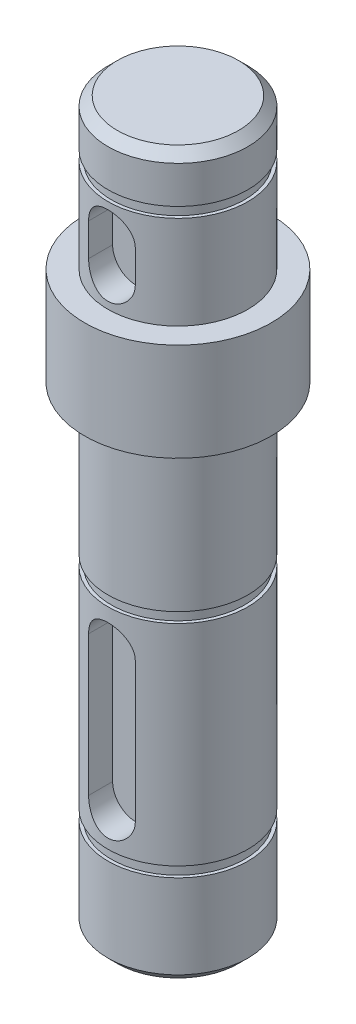
ISO-10303-21;
HEADER;
FILE_DESCRIPTION(('STEP AP214'),'2;1');
FILE_NAME('part.step','',(''),(''),'','','');
FILE_SCHEMA(('AUTOMOTIVE_DESIGN { 1 0 10303 214 1 1 1 1 }'));
ENDSEC;
DATA;
#1=APPLICATION_CONTEXT('core data for automotive mechanical design processes');
#2=APPLICATION_PROTOCOL_DEFINITION('international standard','automotive_design',2000,#1);
#3=PRODUCT_CONTEXT('',#1,'mechanical');
#4=PRODUCT('Part','Part','',(#3));
#5=PRODUCT_RELATED_PRODUCT_CATEGORY('part','',(#4));
#6=PRODUCT_DEFINITION_FORMATION('','',#4);
#7=PRODUCT_DEFINITION_CONTEXT('part definition',#1,'design');
#8=PRODUCT_DEFINITION('design','',#6,#7);
#9=PRODUCT_DEFINITION_SHAPE('','',#8);
#10=(LENGTH_UNIT() NAMED_UNIT(*) SI_UNIT(.MILLI.,.METRE.));
#11=(NAMED_UNIT(*) PLANE_ANGLE_UNIT() SI_UNIT($,.RADIAN.));
#12=(NAMED_UNIT(*) SI_UNIT($,.STERADIAN.) SOLID_ANGLE_UNIT());
#13=UNCERTAINTY_MEASURE_WITH_UNIT(LENGTH_MEASURE(1.E-05),#10,'distance_accuracy_value','');
#14=(GEOMETRIC_REPRESENTATION_CONTEXT(3) GLOBAL_UNCERTAINTY_ASSIGNED_CONTEXT((#13)) GLOBAL_UNIT_ASSIGNED_CONTEXT((#10,
#11,#12)) REPRESENTATION_CONTEXT('',''));
#15=CARTESIAN_POINT('',(0.,0.,0.));
#16=DIRECTION('',(0.,0.,1.));
#17=DIRECTION('',(1.,0.,0.));
#18=AXIS2_PLACEMENT_3D('',#15,#16,#17);
#19=CARTESIAN_POINT('',(0.,0.,0.));
#20=DIRECTION('',(0.,1.,0.));
#21=DIRECTION('',(0.,0.,1.00000000000001));
#22=AXIS2_PLACEMENT_3D('',#19,#20,#21);
#23=PLANE('',#22);
#24=CARTESIAN_POINT('',(0.,0.,0.));
#25=DIRECTION('',(0.,1.,0.));
#26=DIRECTION('',(0.,0.,1.00000000000001));
#27=AXIS2_PLACEMENT_3D('',#24,#25,#26);
#28=CIRCLE('',#27,6.50000000000001);
#29=CARTESIAN_POINT('',(0.,0.,6.50000000000009));
#30=VERTEX_POINT('',#29);
#31=EDGE_CURVE('E205',#30,#30,#28,.F.);
#32=ORIENTED_EDGE('',*,*,#31,.T.);
#33=EDGE_LOOP('',(#32));
#34=FACE_BOUND('',#33,.T.);
#35=ADVANCED_FACE('F32',(#34),#23,.F.);
#36=CARTESIAN_POINT('',(0.,0.,0.));
#37=DIRECTION('',(0.,-1.,0.));
#38=DIRECTION('',(0.,0.,-1.00000000000001));
#39=AXIS2_PLACEMENT_3D('',#36,#37,#38);
#40=CYLINDRICAL_SURFACE('',#39,7.5);
#41=CARTESIAN_POINT('',(0.,1.,0.));
#42=DIRECTION('',(0.,1.,0.));
#43=DIRECTION('',(0.,0.,1.00000000000001));
#44=AXIS2_PLACEMENT_3D('',#41,#42,#43);
#45=CIRCLE('',#44,7.5);
#46=CARTESIAN_POINT('',(0.,1.,7.5000000000001));
#47=VERTEX_POINT('',#46);
#48=EDGE_CURVE('E208',#47,#47,#45,.T.);
#49=ORIENTED_EDGE('',*,*,#48,.T.);
#50=EDGE_LOOP('',(#49));
#51=FACE_BOUND('',#50,.T.);
#52=CARTESIAN_POINT('',(0.,10.,0.));
#53=DIRECTION('',(0.,-1.,0.));
#54=DIRECTION('',(0.,0.,-1.00000000000001));
#55=AXIS2_PLACEMENT_3D('',#52,#53,#54);
#56=CIRCLE('',#55,7.5);
#57=CARTESIAN_POINT('',(0.,10.,-7.5000000000001));
#58=VERTEX_POINT('',#57);
#59=EDGE_CURVE('E196',#58,#58,#56,.T.);
#60=ORIENTED_EDGE('',*,*,#59,.T.);
#61=EDGE_LOOP('',(#60));
#62=FACE_BOUND('',#61,.T.);
#63=ADVANCED_FACE('F292',(#51,#62),#40,.T.);
#64=CARTESIAN_POINT('',(-7.49999999999997,10.,7.7715611723761E-13));
#65=DIRECTION('',(0.,-1.,0.));
#66=DIRECTION('',(0.,0.,-1.00000000000001));
#67=AXIS2_PLACEMENT_3D('',#64,#65,#66);
#68=PLANE('',#67);
#69=ORIENTED_EDGE('',*,*,#59,.F.);
#70=EDGE_LOOP('',(#69));
#71=FACE_BOUND('',#70,.T.);
#72=CARTESIAN_POINT('',(0.,10.,0.));
#73=DIRECTION('',(0.,-1.,0.));
#74=DIRECTION('',(0.,0.,-1.00000000000001));
#75=AXIS2_PLACEMENT_3D('',#72,#73,#74);
#76=CIRCLE('',#75,7.15);
#77=CARTESIAN_POINT('',(0.,10.,-7.1500000000001));
#78=VERTEX_POINT('',#77);
#79=EDGE_CURVE('E193',#78,#78,#76,.T.);
#80=ORIENTED_EDGE('',*,*,#79,.T.);
#81=EDGE_LOOP('',(#80));
#82=FACE_BOUND('',#81,.T.);
#83=ADVANCED_FACE('F298',(#71,#82),#68,.F.);
#84=CARTESIAN_POINT('',(0.,0.,0.));
#85=DIRECTION('',(0.,-1.,0.));
#86=DIRECTION('',(0.,0.,-1.00000000000001));
#87=AXIS2_PLACEMENT_3D('',#84,#85,#86);
#88=CYLINDRICAL_SURFACE('',#87,7.15);
#89=ORIENTED_EDGE('',*,*,#79,.F.);
#90=EDGE_LOOP('',(#89));
#91=FACE_BOUND('',#90,.T.);
#92=CARTESIAN_POINT('',(0.,11.1,0.));
#93=DIRECTION('',(0.,-1.,0.));
#94=DIRECTION('',(0.,0.,-1.00000000000001));
#95=AXIS2_PLACEMENT_3D('',#92,#93,#94);
#96=CIRCLE('',#95,7.15);
#97=CARTESIAN_POINT('',(0.,11.1,-7.1500000000001));
#98=VERTEX_POINT('',#97);
#99=EDGE_CURVE('E190',#98,#98,#96,.T.);
#100=ORIENTED_EDGE('',*,*,#99,.T.);
#101=EDGE_LOOP('',(#100));
#102=FACE_BOUND('',#101,.T.);
#103=ADVANCED_FACE('F324',(#91,#102),#88,.T.);
#104=CARTESIAN_POINT('',(-7.14999999999974,11.1,6.66133814775094E-13));
#105=DIRECTION('',(0.,1.,0.));
#106=DIRECTION('',(0.,0.,1.00000000000001));
#107=AXIS2_PLACEMENT_3D('',#104,#105,#106);
#108=PLANE('',#107);
#109=ORIENTED_EDGE('',*,*,#99,.F.);
#110=EDGE_LOOP('',(#109));
#111=FACE_BOUND('',#110,.T.);
#112=CARTESIAN_POINT('',(0.,11.1,0.));
#113=DIRECTION('',(0.,-1.,0.));
#114=DIRECTION('',(0.,0.,-1.00000000000001));
#115=AXIS2_PLACEMENT_3D('',#112,#113,#114);
#116=CIRCLE('',#115,7.5);
#117=CARTESIAN_POINT('',(0.,11.1,-7.5000000000001));
#118=VERTEX_POINT('',#117);
#119=EDGE_CURVE('E187',#118,#118,#116,.T.);
#120=ORIENTED_EDGE('',*,*,#119,.T.);
#121=EDGE_LOOP('',(#120));
#122=FACE_BOUND('',#121,.T.);
#123=ADVANCED_FACE('F329',(#111,#122),#108,.F.);
#124=CARTESIAN_POINT('',(0.,0.,0.));
#125=DIRECTION('',(0.,-1.,0.));
#126=DIRECTION('',(0.,0.,-1.00000000000001));
#127=AXIS2_PLACEMENT_3D('',#124,#125,#126);
#128=CYLINDRICAL_SURFACE('',#127,7.5);
#129=DIRECTION('',(0.,-1.,0.));
#130=VECTOR('',#129,1.);
#131=CARTESIAN_POINT('',(-2.4999999999996,0.,7.07106781186628));
#132=LINE('',#131,#130);
#133=CARTESIAN_POINT('',(-2.4999999999996,14.6377050832933,7.07106781186628));
#134=VERTEX_POINT('',#133);
#135=CARTESIAN_POINT('',(-2.4999999999996,29.6377050832933,7.07106781186628));
#136=VERTEX_POINT('',#135);
#137=EDGE_CURVE('E471',#134,#136,#132,.F.);
#138=ORIENTED_EDGE('',*,*,#137,.T.);
#139=CARTESIAN_POINT('',(2.50000000000049,29.6377050832933,7.071067811866));
#140=CARTESIAN_POINT('',(2.50000064486976,29.5015346462031,7.07106736326136));
#141=CARTESIAN_POINT('',(2.48883695921412,29.3653680837343,7.07504423227124));
#142=CARTESIAN_POINT('',(2.44462782922232,29.0970690308077,7.09043935203135));
#143=CARTESIAN_POINT('',(2.41157878042144,28.9649372086122,7.10185882855558));
#144=CARTESIAN_POINT('',(2.32488871421272,28.7086378508001,7.13070509222063));
#145=CARTESIAN_POINT('',(2.27128805350842,28.5844552596864,7.14812009928298));
#146=CARTESIAN_POINT('',(2.14515407110364,28.3468049619233,7.18697805025803));
#147=CARTESIAN_POINT('',(2.07261657215068,28.2333396269093,7.20842188259109));
#148=CARTESIAN_POINT('',(1.90762786610741,28.0159051774476,7.25386223518775));
#149=CARTESIAN_POINT('',(1.81456085344498,27.912416511614,7.27792237111622));
#150=CARTESIAN_POINT('',(1.61246916803629,27.7221880802316,7.32534662002484));
#151=CARTESIAN_POINT('',(1.50344193763139,27.6354510043373,7.34871062072425));
#152=CARTESIAN_POINT('',(1.26901126991302,27.4790078399693,7.39284667304532));
#153=CARTESIAN_POINT('',(1.14325477806167,27.4098051567484,7.41353519254015));
#154=CARTESIAN_POINT('',(0.881078057468857,27.2937261204746,7.44923966927449));
#155=CARTESIAN_POINT('',(0.744660714218143,27.2468437503511,7.4642571550752));
#156=CARTESIAN_POINT('',(0.470072043583812,27.1783654467124,7.48647688579775));
#157=CARTESIAN_POINT('',(0.332126887132525,27.1559464676508,7.49393286943879));
#158=CARTESIAN_POINT('',(0.0542446870603909,27.1344143498917,7.50109020545638));
#159=CARTESIAN_POINT('',(-0.0856918338595376,27.1352952041623,7.50079355657322));
#160=CARTESIAN_POINT('',(-0.357758787984247,27.1598157197084,7.49265099046906));
#161=CARTESIAN_POINT('',(-0.489980121478803,27.1825614044796,7.48510161887804));
#162=CARTESIAN_POINT('',(-0.748608597055104,27.2486875357445,7.46367418349324));
#163=CARTESIAN_POINT('',(-0.875015344447776,27.2920693807429,7.44979569078));
#164=CARTESIAN_POINT('',(-1.1203811871047,27.3987583765585,7.41689175733119));
#165=CARTESIAN_POINT('',(-1.23922055242185,27.4623199296597,7.39780106310056));
#166=CARTESIAN_POINT('',(-1.46481081381815,27.607354346915,7.35645982597288));
#167=CARTESIAN_POINT('',(-1.57155833596333,27.6888321916124,7.33420840503671));
#168=CARTESIAN_POINT('',(-1.7752521663782,27.8718910669425,7.28765479624743));
#169=CARTESIAN_POINT('',(-1.87150039266294,27.974237977897,7.26330537922178));
#170=CARTESIAN_POINT('',(-2.04569314899506,28.1938268976099,7.21618338122284));
#171=CARTESIAN_POINT('',(-2.12363485820353,28.3110711976135,7.19341104364138));
#172=CARTESIAN_POINT('',(-2.25996863758904,28.5593391473019,7.15176312802871));
#173=CARTESIAN_POINT('',(-2.31806615905298,28.6905354115877,7.13294773211882));
#174=CARTESIAN_POINT('',(-2.41110798317304,28.9616335688293,7.10204127060972));
#175=CARTESIAN_POINT('',(-2.44606198936855,29.1015317863089,7.08994738717817));
#176=CARTESIAN_POINT('',(-2.49040320524364,29.3793009718222,7.07449090789047));
#177=CARTESIAN_POINT('',(-2.50087273876883,29.5169786451649,7.07075900796904));
#178=CARTESIAN_POINT('',(-2.49901359727394,29.7921454560785,7.07141680147968));
#179=CARTESIAN_POINT('',(-2.48668906306654,29.9296346233532,7.07580501979606));
#180=CARTESIAN_POINT('',(-2.4405641288804,30.1955974975731,7.09184045225822));
#181=CARTESIAN_POINT('',(-2.40751598495134,30.3242186586704,7.10323313602119));
#182=CARTESIAN_POINT('',(-2.32178465640091,30.5740640988913,7.1317138417756));
#183=CARTESIAN_POINT('',(-2.2690979909084,30.6952870622703,7.1488028733714));
#184=CARTESIAN_POINT('',(-2.14368585184719,30.9311561354108,7.18742193989518));
#185=CARTESIAN_POINT('',(-2.07037779589599,31.0454716898977,7.20907564164091));
#186=CARTESIAN_POINT('',(-1.90646407639369,31.2605702142525,7.25414421827406));
#187=CARTESIAN_POINT('',(-1.81585331374691,31.3613491799464,7.27755961109483));
#188=CARTESIAN_POINT('',(-1.61472926475084,31.5515250435199,7.32487596594625));
#189=CARTESIAN_POINT('',(-1.50346817636656,31.6401410583403,7.34874608944744));
#190=CARTESIAN_POINT('',(-1.26706822850055,31.7974954391633,7.39317129032773));
#191=CARTESIAN_POINT('',(-1.14192986216136,31.8662345111993,7.41372648544236));
#192=CARTESIAN_POINT('',(-0.881949656080766,31.9812553454476,7.44911014526505));
#193=CARTESIAN_POINT('',(-0.747177808302993,32.0276832761634,7.46397575011325));
#194=CARTESIAN_POINT('',(-0.471146164615023,32.0970244384435,7.48646527094439));
#195=CARTESIAN_POINT('',(-0.329888729884711,32.1199461579946,7.49409180085055));
#196=CARTESIAN_POINT('',(-0.0520383396500712,32.1408602773075,7.50104658090635));
#197=CARTESIAN_POINT('',(0.0844618098001009,32.1399737181243,7.50074800223573));
#198=CARTESIAN_POINT('',(0.355277862500582,32.1160618129273,7.49280491298519));
#199=CARTESIAN_POINT('',(0.489593942047859,32.0930382629114,7.48516099834033));
#200=CARTESIAN_POINT('',(0.750105298580378,32.0262494968534,7.46352287386108));
#201=CARTESIAN_POINT('',(0.876395677282151,31.982819544911,7.44963145902865));
#202=CARTESIAN_POINT('',(1.11994587734974,31.8767612555505,7.41692901761238));
#203=CARTESIAN_POINT('',(1.23720406035646,31.8141294453008,7.39811710120132));
#204=CARTESIAN_POINT('',(1.46408504077233,31.6687813030383,7.35664672069797));
#205=CARTESIAN_POINT('',(1.57326562889425,31.5854083698394,7.33387181229817));
#206=CARTESIAN_POINT('',(1.77645256568119,31.402061605403,7.28732471979691));
#207=CARTESIAN_POINT('',(1.87045405406162,31.3020824776365,7.2635522193282));
#208=CARTESIAN_POINT('',(2.04435452208298,31.0836816943259,7.21658199564078));
#209=CARTESIAN_POINT('',(2.12355741499494,30.9646913058518,7.19344319971572));
#210=CARTESIAN_POINT('',(2.26078585825307,30.7143690160365,7.15150483307528));
#211=CARTESIAN_POINT('',(2.31881694204906,30.5830403507192,7.13270412903195));
#212=CARTESIAN_POINT('',(2.40960957051077,30.3178005232542,7.10253335516356));
#213=CARTESIAN_POINT('',(2.44339477287406,30.1842744244799,7.09086582142949));
#214=CARTESIAN_POINT('',(2.4885858003735,29.9130649571266,7.07513458848781));
#215=CARTESIAN_POINT('',(2.49999934799198,29.7753830397666,7.07106826543707));
#216=CARTESIAN_POINT('',(2.50000000000049,29.6377050832933,7.071067811866));
#217=B_SPLINE_CURVE_WITH_KNOTS('',3,(#139,#140,#141,#142,#143,#144,#145,#146,#147,#148,#149,
#150,#151,#152,#153,#154,#155,#156,#157,#158,#159,#160,#161,#162,#163,#164,#165,#166,#167,#168,
#169,#170,#171,#172,#173,#174,#175,#176,#177,#178,#179,#180,#181,#182,#183,#184,#185,#186,#187,
#188,#189,#190,#191,#192,#193,#194,#195,#196,#197,#198,#199,#200,#201,#202,#203,#204,#205,#206,
#207,#208,#209,#210,#211,#212,#213,#214,#215,#216),.UNSPECIFIED.,.T.,.F.,(4,2,2,2,2,2,2,2,2,2,2,
2,2,2,2,2,2,2,2,2,2,2,2,2,2,2,2,2,2,2,2,2,2,2,2,2,2,2,4),(0.,0.408001461998408,
0.816070137537933,1.22334156875217,1.63070291546379,2.05253343568925,2.47443162929956,
2.90733765359145,3.34012690966998,3.75785796912353,4.17548133255821,4.57672512063922,
4.97799610473093,5.38454137150855,5.79119979685083,6.217004359098,6.64287449030255,
7.07481599607636,7.50657628391537,7.91885728411096,8.33106339593086,8.72910989421941,
9.12722697867361,9.53797144339273,9.94883714155295,10.3794702042771,10.810087968938,
11.237844779771,11.6654470751036,12.0729521169407,12.4804241002444,12.8814239010107,
13.2824962690811,13.6983879880158,14.1144126108156,14.5467225684035,14.9789194566717,
15.3915803040673,15.8040986797616),.UNSPECIFIED.);
#218=CARTESIAN_POINT('',(2.50000000000049,29.6377050832933,7.071067811866));
#219=VERTEX_POINT('',#218);
#220=EDGE_CURVE('E211',#136,#219,#217,.T.);
#221=ORIENTED_EDGE('',*,*,#220,.T.);
#222=DIRECTION('',(0.,-1.,0.));
#223=VECTOR('',#222,1.);
#224=CARTESIAN_POINT('',(2.5000000000005,0.,7.07106781186603));
#225=LINE('',#224,#223);
#226=CARTESIAN_POINT('',(2.5000000000005,14.6377050832933,7.07106781186603));
#227=VERTEX_POINT('',#226);
#228=EDGE_CURVE('E473',#219,#227,#225,.T.);
#229=ORIENTED_EDGE('',*,*,#228,.T.);
#230=CARTESIAN_POINT('',(2.50000000000049,14.6377050832933,7.071067811866));
#231=CARTESIAN_POINT('',(2.50000899110442,14.569498005473,7.07105693273163));
#232=CARTESIAN_POINT('',(2.49720887221616,14.5012970086179,7.07205443904562));
#233=CARTESIAN_POINT('',(2.48606045780499,14.365424044944,7.07598524120994));
#234=CARTESIAN_POINT('',(2.47771365997232,14.2977519403052,7.07891801450636));
#235=CARTESIAN_POINT('',(2.45557459422824,14.1636145949387,7.08662705252492));
#236=CARTESIAN_POINT('',(2.44179847763162,14.0971463807424,7.09139784850088));
#237=CARTESIAN_POINT('',(2.40894181030153,13.9656968147105,7.10262619906012));
#238=CARTESIAN_POINT('',(2.38986106786074,13.9007155167034,7.10908381460397));
#239=CARTESIAN_POINT('',(2.32491551306247,13.7087435035787,7.13069940794033));
#240=CARTESIAN_POINT('',(2.27131416810282,13.5845259258232,7.14811243884055));
#241=CARTESIAN_POINT('',(2.14517784106272,13.3468282718298,7.18697034087501));
#242=CARTESIAN_POINT('',(2.07263123268553,13.2333548475131,7.20841768551152));
#243=CARTESIAN_POINT('',(1.90762995846841,13.0159121798226,7.25386182389573));
#244=CARTESIAN_POINT('',(1.81456284630853,12.9124199405251,7.27792189428079));
#245=CARTESIAN_POINT('',(1.61247071190543,12.7221879800596,7.32534626726013));
#246=CARTESIAN_POINT('',(1.50344285413703,12.6354512419743,7.34871044533539));
#247=CARTESIAN_POINT('',(1.2690092249402,12.4790068590309,7.39284706096379));
#248=CARTESIAN_POINT('',(1.14325025284497,12.4098027755511,7.41353593532889));
#249=CARTESIAN_POINT('',(0.88107309547547,12.2937243008586,7.4492402188327));
#250=CARTESIAN_POINT('',(0.744658181225998,12.2468430883676,7.46425736081219));
#251=CARTESIAN_POINT('',(0.470073371182981,12.1783658070351,7.48647677762791));
#252=CARTESIAN_POINT('',(0.332129588153846,12.1559469123361,7.49393272446123));
#253=CARTESIAN_POINT('',(0.0542474216363665,12.1344143265548,7.50109021034845));
#254=CARTESIAN_POINT('',(-0.0856904786400141,12.1352950823776,7.50079359709989));
#255=CARTESIAN_POINT('',(-0.357759612692117,12.1598157936938,7.49265096581853));
#256=CARTESIAN_POINT('',(-0.489981756427838,12.182561678898,7.48510152476457));
#257=CARTESIAN_POINT('',(-0.748610161076991,12.2486880792725,7.46367401253766));
#258=CARTESIAN_POINT('',(-0.875016099077476,12.2920697386186,7.44979559044836));
#259=CARTESIAN_POINT('',(-1.12038155754012,12.3987585074878,7.41689170677851));
#260=CARTESIAN_POINT('',(-1.23922126412477,12.462320196151,7.39780094595673));
#261=CARTESIAN_POINT('',(-1.46481147275351,12.6073549617183,7.35645969200226));
#262=CARTESIAN_POINT('',(-1.57155867428941,12.6888329108954,7.33420833994021));
#263=CARTESIAN_POINT('',(-1.77524334927512,12.8718827083002,7.28765679856814));
#264=CARTESIAN_POINT('',(-1.87148402903074,12.9742189423215,7.2633094669976));
#265=CARTESIAN_POINT('',(-2.04568006205137,13.1938088075798,7.21618726182169));
#266=CARTESIAN_POINT('',(-2.12362950795945,13.3110672393004,7.19341289789482));
#267=CARTESIAN_POINT('',(-2.26000831398147,13.5594055291776,7.15175078440873));
#268=CARTESIAN_POINT('',(-2.31813252376879,13.6906638706259,7.13292537370588));
#269=CARTESIAN_POINT('',(-2.41115057675256,13.9618225272679,7.10202742655118));
#270=CARTESIAN_POINT('',(-2.44608109013827,14.1017088167236,7.08994423522599));
#271=CARTESIAN_POINT('',(-2.47914539070187,14.3087516751633,7.0784135523687));
#272=CARTESIAN_POINT('',(-2.48696265313753,14.3743085579289,7.07566669236534));
#273=CARTESIAN_POINT('',(-2.49738654017764,14.5058002792928,7.0719925892849));
#274=CARTESIAN_POINT('',(-2.49999988848705,14.5717345196543,7.07106299823818));
#275=CARTESIAN_POINT('',(-2.49999999999961,14.6377050832933,7.07106781186626));
#276=B_SPLINE_CURVE_WITH_KNOTS('',3,(#230,#231,#232,#233,#234,#235,#236,#237,#238,#239,#240,
#241,#242,#243,#244,#245,#246,#247,#248,#249,#250,#251,#252,#253,#254,#255,#256,#257,#258,#259,
#260,#261,#262,#263,#264,#265,#266,#267,#268,#269,#270,#271,#272,#273,#274,#275),.UNSPECIFIED.,
.F.,.F.,(4,2,2,2,2,2,2,2,2,2,2,2,2,2,2,2,2,2,2,2,2,2,4),(0.,0.204546211838629,0.409037215423707,
0.612924429429108,0.816819012805421,1.22401016923265,1.63145179965543,2.05327864088394,
2.47518051341048,2.90809434014451,3.34087579484539,3.7586027850022,4.17623021758304,
4.57747647846033,4.97874498952317,5.38529148746632,5.79194868153645,6.2177173682683,
6.64362337304795,7.07581676501797,7.50732520398797,7.70536340013576,7.9031455550434),.UNSPECIFIED.);
#277=EDGE_CURVE('E55',#227,#134,#276,.T.);
#278=ORIENTED_EDGE('',*,*,#277,.T.);
#279=EDGE_LOOP('',(#138,#221,#229,#278));
#280=FACE_BOUND('',#279,.T.);
#281=ORIENTED_EDGE('',*,*,#119,.F.);
#282=EDGE_LOOP('',(#281));
#283=FACE_BOUND('',#282,.T.);
#284=CARTESIAN_POINT('',(0.,33.6,0.));
#285=DIRECTION('',(0.,-1.,0.));
#286=DIRECTION('',(0.,0.,-1.00000000000001));
#287=AXIS2_PLACEMENT_3D('',#284,#285,#286);
#288=CIRCLE('',#287,7.5);
#289=CARTESIAN_POINT('',(0.,33.6,-7.5000000000001));
#290=VERTEX_POINT('',#289);
#291=EDGE_CURVE('E184',#290,#290,#288,.T.);
#292=ORIENTED_EDGE('',*,*,#291,.T.);
#293=EDGE_LOOP('',(#292));
#294=FACE_BOUND('',#293,.T.);
#295=ADVANCED_FACE('F223',(#280,#283,#294),#128,.T.);
#296=CARTESIAN_POINT('',(-7.49999999999997,33.6,7.7715611723761E-13));
#297=DIRECTION('',(0.,-1.,0.));
#298=DIRECTION('',(0.,0.,-1.00000000000001));
#299=AXIS2_PLACEMENT_3D('',#296,#297,#298);
#300=PLANE('',#299);
#301=ORIENTED_EDGE('',*,*,#291,.F.);
#302=EDGE_LOOP('',(#301));
#303=FACE_BOUND('',#302,.T.);
#304=CARTESIAN_POINT('',(0.,33.6,0.));
#305=DIRECTION('',(0.,-1.,0.));
#306=DIRECTION('',(0.,0.,-1.00000000000001));
#307=AXIS2_PLACEMENT_3D('',#304,#305,#306);
#308=CIRCLE('',#307,7.15);
#309=CARTESIAN_POINT('',(0.,33.6,-7.1500000000001));
#310=VERTEX_POINT('',#309);
#311=EDGE_CURVE('E181',#310,#310,#308,.T.);
#312=ORIENTED_EDGE('',*,*,#311,.T.);
#313=EDGE_LOOP('',(#312));
#314=FACE_BOUND('',#313,.T.);
#315=ADVANCED_FACE('F339',(#303,#314),#300,.F.);
#316=CARTESIAN_POINT('',(0.,0.,0.));
#317=DIRECTION('',(0.,-1.,0.));
#318=DIRECTION('',(0.,0.,-1.00000000000001));
#319=AXIS2_PLACEMENT_3D('',#316,#317,#318);
#320=CYLINDRICAL_SURFACE('',#319,7.15);
#321=ORIENTED_EDGE('',*,*,#311,.F.);
#322=EDGE_LOOP('',(#321));
#323=FACE_BOUND('',#322,.T.);
#324=CARTESIAN_POINT('',(0.,34.7,0.));
#325=DIRECTION('',(0.,-1.,0.));
#326=DIRECTION('',(0.,0.,-1.00000000000001));
#327=AXIS2_PLACEMENT_3D('',#324,#325,#326);
#328=CIRCLE('',#327,7.15);
#329=CARTESIAN_POINT('',(0.,34.7,-7.1500000000001));
#330=VERTEX_POINT('',#329);
#331=EDGE_CURVE('E178',#330,#330,#328,.T.);
#332=ORIENTED_EDGE('',*,*,#331,.T.);
#333=EDGE_LOOP('',(#332));
#334=FACE_BOUND('',#333,.T.);
#335=ADVANCED_FACE('F345',(#323,#334),#320,.T.);
#336=CARTESIAN_POINT('',(-7.14999999999974,34.7,6.66133814775094E-13));
#337=DIRECTION('',(0.,1.,0.));
#338=DIRECTION('',(0.,0.,1.00000000000001));
#339=AXIS2_PLACEMENT_3D('',#336,#337,#338);
#340=PLANE('',#339);
#341=ORIENTED_EDGE('',*,*,#331,.F.);
#342=EDGE_LOOP('',(#341));
#343=FACE_BOUND('',#342,.T.);
#344=CARTESIAN_POINT('',(0.,34.7,0.));
#345=DIRECTION('',(0.,-1.,0.));
#346=DIRECTION('',(0.,0.,-1.00000000000001));
#347=AXIS2_PLACEMENT_3D('',#344,#345,#346);
#348=CIRCLE('',#347,7.5);
#349=CARTESIAN_POINT('',(0.,34.7,-7.5000000000001));
#350=VERTEX_POINT('',#349);
#351=EDGE_CURVE('E175',#350,#350,#348,.T.);
#352=ORIENTED_EDGE('',*,*,#351,.T.);
#353=EDGE_LOOP('',(#352));
#354=FACE_BOUND('',#353,.T.);
#355=ADVANCED_FACE('F350',(#343,#354),#340,.F.);
#356=CARTESIAN_POINT('',(0.,0.,0.));
#357=DIRECTION('',(0.,-1.,0.));
#358=DIRECTION('',(0.,0.,-1.00000000000001));
#359=AXIS2_PLACEMENT_3D('',#356,#357,#358);
#360=CYLINDRICAL_SURFACE('',#359,7.5);
#361=ORIENTED_EDGE('',*,*,#351,.F.);
#362=EDGE_LOOP('',(#361));
#363=FACE_BOUND('',#362,.T.);
#364=CARTESIAN_POINT('',(0.,50.7,0.));
#365=DIRECTION('',(0.,-1.,0.));
#366=DIRECTION('',(0.,0.,-1.00000000000001));
#367=AXIS2_PLACEMENT_3D('',#364,#365,#366);
#368=CIRCLE('',#367,7.5);
#369=CARTESIAN_POINT('',(0.,50.7,-7.5000000000001));
#370=VERTEX_POINT('',#369);
#371=EDGE_CURVE('E172',#370,#370,#368,.T.);
#372=ORIENTED_EDGE('',*,*,#371,.T.);
#373=EDGE_LOOP('',(#372));
#374=FACE_BOUND('',#373,.T.);
#375=ADVANCED_FACE('F356',(#363,#374),#360,.T.);
#376=CARTESIAN_POINT('',(-7.49999999999997,50.7,7.7715611723761E-13));
#377=DIRECTION('',(0.,1.,0.));
#378=DIRECTION('',(0.,0.,1.00000000000001));
#379=AXIS2_PLACEMENT_3D('',#376,#377,#378);
#380=PLANE('',#379);
#381=ORIENTED_EDGE('',*,*,#371,.F.);
#382=EDGE_LOOP('',(#381));
#383=FACE_BOUND('',#382,.T.);
#384=CARTESIAN_POINT('',(0.,50.7,0.));
#385=DIRECTION('',(0.,-1.,0.));
#386=DIRECTION('',(0.,0.,-1.00000000000001));
#387=AXIS2_PLACEMENT_3D('',#384,#385,#386);
#388=CIRCLE('',#387,10.);
#389=CARTESIAN_POINT('',(0.,50.7,-10.0000000000001));
#390=VERTEX_POINT('',#389);
#391=EDGE_CURVE('E169',#390,#390,#388,.T.);
#392=ORIENTED_EDGE('',*,*,#391,.T.);
#393=EDGE_LOOP('',(#392));
#394=FACE_BOUND('',#393,.T.);
#395=ADVANCED_FACE('F362',(#383,#394),#380,.F.);
#396=CARTESIAN_POINT('',(0.,0.,0.));
#397=DIRECTION('',(0.,-1.,0.));
#398=DIRECTION('',(0.,0.,-1.00000000000001));
#399=AXIS2_PLACEMENT_3D('',#396,#397,#398);
#400=CYLINDRICAL_SURFACE('',#399,10.);
#401=ORIENTED_EDGE('',*,*,#391,.F.);
#402=EDGE_LOOP('',(#401));
#403=FACE_BOUND('',#402,.T.);
#404=CARTESIAN_POINT('',(0.,61.2,0.));
#405=DIRECTION('',(0.,-1.,0.));
#406=DIRECTION('',(0.,0.,-1.00000000000001));
#407=AXIS2_PLACEMENT_3D('',#404,#405,#406);
#408=CIRCLE('',#407,10.);
#409=CARTESIAN_POINT('',(0.,61.2,-10.0000000000001));
#410=VERTEX_POINT('',#409);
#411=EDGE_CURVE('E166',#410,#410,#408,.T.);
#412=ORIENTED_EDGE('',*,*,#411,.T.);
#413=EDGE_LOOP('',(#412));
#414=FACE_BOUND('',#413,.T.);
#415=ADVANCED_FACE('F368',(#403,#414),#400,.T.);
#416=CARTESIAN_POINT('',(-9.99999999999994,61.2,8.60422844084496E-13));
#417=DIRECTION('',(0.,-1.,0.));
#418=DIRECTION('',(0.,0.,-1.00000000000001));
#419=AXIS2_PLACEMENT_3D('',#416,#417,#418);
#420=PLANE('',#419);
#421=ORIENTED_EDGE('',*,*,#411,.F.);
#422=EDGE_LOOP('',(#421));
#423=FACE_BOUND('',#422,.T.);
#424=CARTESIAN_POINT('',(0.,61.2,0.));
#425=DIRECTION('',(0.,-1.,0.));
#426=DIRECTION('',(0.,0.,-1.00000000000001));
#427=AXIS2_PLACEMENT_3D('',#424,#425,#426);
#428=CIRCLE('',#427,7.5);
#429=CARTESIAN_POINT('',(0.,61.2,-7.5000000000001));
#430=VERTEX_POINT('',#429);
#431=EDGE_CURVE('E163',#430,#430,#428,.T.);
#432=ORIENTED_EDGE('',*,*,#431,.T.);
#433=EDGE_LOOP('',(#432));
#434=FACE_BOUND('',#433,.T.);
#435=ADVANCED_FACE('F268',(#423,#434),#420,.F.);
#436=CARTESIAN_POINT('',(0.,0.,0.));
#437=DIRECTION('',(0.,-1.,0.));
#438=DIRECTION('',(0.,0.,-1.00000000000001));
#439=AXIS2_PLACEMENT_3D('',#436,#437,#438);
#440=CYLINDRICAL_SURFACE('',#439,7.5);
#441=DIRECTION('',(0.,-1.,0.));
#442=VECTOR('',#441,1.);
#443=CARTESIAN_POINT('',(-2.4999999999996,0.,7.07106781186628));
#444=LINE('',#443,#442);
#445=CARTESIAN_POINT('',(-2.4999999999996,64.45,7.07106781186628));
#446=VERTEX_POINT('',#445);
#447=CARTESIAN_POINT('',(-2.49999999999961,67.95,7.07106781186626));
#448=VERTEX_POINT('',#447);
#449=EDGE_CURVE('E11',#446,#448,#444,.F.);
#450=ORIENTED_EDGE('',*,*,#449,.T.);
#451=CARTESIAN_POINT('',(2.50000000000049,67.95,7.071067811866));
#452=CARTESIAN_POINT('',(2.50000064486976,67.8138295629098,7.07106736326136));
#453=CARTESIAN_POINT('',(2.48883695921411,67.677663000441,7.07504423227124));
#454=CARTESIAN_POINT('',(2.44462782922231,67.4093639475144,7.09043935203135));
#455=CARTESIAN_POINT('',(2.41157878042145,67.2772321253188,7.10185882855558));
#456=CARTESIAN_POINT('',(2.32488871421272,67.0209327675067,7.13070509222063));
#457=CARTESIAN_POINT('',(2.27128805350841,66.8967501763931,7.14812009928298));
#458=CARTESIAN_POINT('',(2.14515407110363,66.65909987863,7.18697805025803));
#459=CARTESIAN_POINT('',(2.07261657215068,66.5456345436159,7.20842188259109));
#460=CARTESIAN_POINT('',(1.90762786610741,66.3282000941543,7.25386223518775));
#461=CARTESIAN_POINT('',(1.81456085344498,66.2247114283207,7.27792237111622));
#462=CARTESIAN_POINT('',(1.61246916803629,66.0344829969383,7.32534662002484));
#463=CARTESIAN_POINT('',(1.50344193763139,65.947745921044,7.34871062072425));
#464=CARTESIAN_POINT('',(1.26901126991301,65.791302756676,7.39284667304532));
#465=CARTESIAN_POINT('',(1.14325477806166,65.7221000734551,7.41353519254015));
#466=CARTESIAN_POINT('',(0.881078057468845,65.6060210371812,7.44923966927449));
#467=CARTESIAN_POINT('',(0.744660714218142,65.5591386670577,7.4642571550752));
#468=CARTESIAN_POINT('',(0.470072043583816,65.490660363419,7.48647688579775));
#469=CARTESIAN_POINT('',(0.332126887132524,65.4682413843575,7.49393286943879));
#470=CARTESIAN_POINT('',(0.0542446870603876,65.4467092665984,7.50109020545638));
#471=CARTESIAN_POINT('',(-0.0856918338595384,65.447590120869,7.50079355657322));
#472=CARTESIAN_POINT('',(-0.357758787984247,65.4721106364151,7.49265099046906));
#473=CARTESIAN_POINT('',(-0.489980121478804,65.4948563211862,7.48510161887804));
#474=CARTESIAN_POINT('',(-0.748608597055105,65.5609824524512,7.46367418349324));
#475=CARTESIAN_POINT('',(-0.875015344447777,65.6043642974495,7.44979569078));
#476=CARTESIAN_POINT('',(-1.1203811871047,65.7110532932652,7.41689175733119));
#477=CARTESIAN_POINT('',(-1.23922055242185,65.7746148463664,7.39780106310056));
#478=CARTESIAN_POINT('',(-1.46481081381815,65.9196492636217,7.35645982597288));
#479=CARTESIAN_POINT('',(-1.57155833596333,66.0011271083191,7.33420840503671));
#480=CARTESIAN_POINT('',(-1.77525216637821,66.1841859836492,7.28765479624743));
#481=CARTESIAN_POINT('',(-1.87150039266294,66.2865328946037,7.26330537922179));
#482=CARTESIAN_POINT('',(-2.04569314899508,66.5061218143166,7.21618338122283));
#483=CARTESIAN_POINT('',(-2.12363485820357,66.6233661143201,7.19341104364132));
#484=CARTESIAN_POINT('',(-2.25996863758907,66.8716340640086,7.15176312802865));
#485=CARTESIAN_POINT('',(-2.31806615905299,67.0028303282944,7.1329477321188));
#486=CARTESIAN_POINT('',(-2.41110798317303,67.273928485536,7.10204127060973));
#487=CARTESIAN_POINT('',(-2.44606198936855,67.4138267030156,7.08994738717818));
#488=CARTESIAN_POINT('',(-2.49040320524364,67.6915958885289,7.07449090789047));
#489=CARTESIAN_POINT('',(-2.50087273876882,67.8292735618716,7.07075900796905));
#490=CARTESIAN_POINT('',(-2.49901359727395,68.1044403727852,7.07141680147967));
#491=CARTESIAN_POINT('',(-2.48668906306655,68.2419295400599,7.07580501979604));
#492=CARTESIAN_POINT('',(-2.44056412888041,68.5078924142798,7.0918404522582));
#493=CARTESIAN_POINT('',(-2.40751598495135,68.6365135753771,7.10323313602118));
#494=CARTESIAN_POINT('',(-2.32178465640091,68.886359015598,7.1317138417756));
#495=CARTESIAN_POINT('',(-2.2690979909084,69.007581978977,7.1488028733714));
#496=CARTESIAN_POINT('',(-2.14368585184719,69.2434510521175,7.18742193989518));
#497=CARTESIAN_POINT('',(-2.07037779589599,69.3577666066044,7.2090756416409));
#498=CARTESIAN_POINT('',(-1.90646407639369,69.5728651309592,7.25414421827406));
#499=CARTESIAN_POINT('',(-1.8158533137469,69.6736440966531,7.27755961109483));
#500=CARTESIAN_POINT('',(-1.61472926475084,69.8638199602266,7.32487596594625));
#501=CARTESIAN_POINT('',(-1.50346817636656,69.952435975047,7.34874608944744));
#502=CARTESIAN_POINT('',(-1.26706822850055,70.10979035587,7.39317129032773));
#503=CARTESIAN_POINT('',(-1.14192986216136,70.178529427906,7.41372648544236));
#504=CARTESIAN_POINT('',(-0.881949656080765,70.2935502621543,7.44911014526505));
#505=CARTESIAN_POINT('',(-0.747177808302993,70.3399781928701,7.46397575011325));
#506=CARTESIAN_POINT('',(-0.471146164615023,70.4093193551502,7.48646527094439));
#507=CARTESIAN_POINT('',(-0.32988872988471,70.4322410747012,7.49409180085055));
#508=CARTESIAN_POINT('',(-0.0520383396500722,70.4531551940141,7.50104658090635));
#509=CARTESIAN_POINT('',(0.0844618098000968,70.452268634831,7.50074800223573));
#510=CARTESIAN_POINT('',(0.355277862500581,70.428356729634,7.49280491298519));
#511=CARTESIAN_POINT('',(0.489593942047864,70.4053331796181,7.48516099834033));
#512=CARTESIAN_POINT('',(0.75010529858038,70.3385444135601,7.46352287386108));
#513=CARTESIAN_POINT('',(0.876395677282143,70.2951144616177,7.44963145902865));
#514=CARTESIAN_POINT('',(1.11994587734973,70.1890561722572,7.41692901761238));
#515=CARTESIAN_POINT('',(1.23720406035645,70.1264243620075,7.39811710120132));
#516=CARTESIAN_POINT('',(1.46408504077233,69.981076219745,7.35664672069797));
#517=CARTESIAN_POINT('',(1.57326562889425,69.897703286546,7.33387181229817));
#518=CARTESIAN_POINT('',(1.77645256568119,69.7143565221096,7.2873247197969));
#519=CARTESIAN_POINT('',(1.87045405406162,69.6143773943432,7.2635522193282));
#520=CARTESIAN_POINT('',(2.04435452208298,69.3959766110326,7.21658199564078));
#521=CARTESIAN_POINT('',(2.12355741499495,69.2769862225585,7.19344319971572));
#522=CARTESIAN_POINT('',(2.26078585825307,69.0266639327432,7.15150483307528));
#523=CARTESIAN_POINT('',(2.31881694204906,68.8953352674259,7.13270412903195));
#524=CARTESIAN_POINT('',(2.40960957051076,68.6300954399609,7.10253335516356));
#525=CARTESIAN_POINT('',(2.44339477287406,68.4965693411866,7.09086582142949));
#526=CARTESIAN_POINT('',(2.4885858003735,68.2253598738333,7.07513458848781));
#527=CARTESIAN_POINT('',(2.49999934799198,68.0876779564733,7.07106826543707));
#528=CARTESIAN_POINT('',(2.50000000000049,67.95,7.071067811866));
#529=B_SPLINE_CURVE_WITH_KNOTS('',3,(#451,#452,#453,#454,#455,#456,#457,#458,#459,#460,#461,
#462,#463,#464,#465,#466,#467,#468,#469,#470,#471,#472,#473,#474,#475,#476,#477,#478,#479,#480,
#481,#482,#483,#484,#485,#486,#487,#488,#489,#490,#491,#492,#493,#494,#495,#496,#497,#498,#499,
#500,#501,#502,#503,#504,#505,#506,#507,#508,#509,#510,#511,#512,#513,#514,#515,#516,#517,#518,
#519,#520,#521,#522,#523,#524,#525,#526,#527,#528),.UNSPECIFIED.,.T.,.F.,(4,2,2,2,2,2,2,2,2,2,2,
2,2,2,2,2,2,2,2,2,2,2,2,2,2,2,2,2,2,2,2,2,2,2,2,2,2,2,4),(0.,0.408001461998429,
0.816070137537987,1.22334156875219,1.63070291546379,2.05253343568926,2.47443162929957,
2.90733765359147,3.34012690967,3.75785796912354,4.17548133255822,4.57672512063923,
4.97799610473094,5.38454137150855,5.79119979685084,6.21700435909804,6.64287449030259,
7.07481599607636,7.50657628391539,7.91885728411097,8.33106339593087,8.72910989421943,
9.12722697867363,9.53797144339276,9.94883714155297,10.3794702042771,10.810087968938,
11.237844779771,11.6654470751037,12.0729521169407,12.4804241002445,12.8814239010107,
13.2824962690811,13.6983879880158,14.1144126108157,14.5467225684036,14.9789194566717,
15.3915803040673,15.8040986797617),.UNSPECIFIED.);
#530=CARTESIAN_POINT('',(2.50000000000049,67.95,7.071067811866));
#531=VERTEX_POINT('',#530);
#532=EDGE_CURVE('E273',#448,#531,#529,.T.);
#533=ORIENTED_EDGE('',*,*,#532,.T.);
#534=DIRECTION('',(0.,-1.,0.));
#535=VECTOR('',#534,1.);
#536=CARTESIAN_POINT('',(2.50000000000049,0.,7.071067811866));
#537=LINE('',#536,#535);
#538=CARTESIAN_POINT('',(2.50000000000049,64.45,7.071067811866));
#539=VERTEX_POINT('',#538);
#540=EDGE_CURVE('E40',#531,#539,#537,.T.);
#541=ORIENTED_EDGE('',*,*,#540,.T.);
#542=CARTESIAN_POINT('',(2.50000000000049,64.45,7.071067811866));
#543=CARTESIAN_POINT('',(2.50000899110442,64.3817929221797,7.07105693273163));
#544=CARTESIAN_POINT('',(2.49720887221617,64.3135919253246,7.07205443904562));
#545=CARTESIAN_POINT('',(2.48606045780499,64.1777189616507,7.07598524120994));
#546=CARTESIAN_POINT('',(2.47771365997232,64.1100468570119,7.07891801450636));
#547=CARTESIAN_POINT('',(2.45557459422824,63.9759095116454,7.08662705252492));
#548=CARTESIAN_POINT('',(2.44179847763162,63.9094412974491,7.09139784850088));
#549=CARTESIAN_POINT('',(2.40894181030153,63.7779917314172,7.10262619906013));
#550=CARTESIAN_POINT('',(2.38986106786074,63.7130104334101,7.10908381460398));
#551=CARTESIAN_POINT('',(2.32491551306247,63.5210384202854,7.13069940794033));
#552=CARTESIAN_POINT('',(2.27131416810282,63.3968208425299,7.14811243884055));
#553=CARTESIAN_POINT('',(2.14517784106272,63.1591231885365,7.18697034087501));
#554=CARTESIAN_POINT('',(2.07263123268553,63.0456497642198,7.20841768551152));
#555=CARTESIAN_POINT('',(1.90762995846841,62.8282070965293,7.25386182389573));
#556=CARTESIAN_POINT('',(1.81456284630851,62.7247148572318,7.2779218942808));
#557=CARTESIAN_POINT('',(1.61247071190542,62.5344828967662,7.32534626726014));
#558=CARTESIAN_POINT('',(1.50344285413703,62.4477461586809,7.34871044533539));
#559=CARTESIAN_POINT('',(1.26900922494021,62.2913017757375,7.39284706096379));
#560=CARTESIAN_POINT('',(1.14325025284497,62.2220976922577,7.41353593532889));
#561=CARTESIAN_POINT('',(0.881073095475459,62.1060192175653,7.4492402188327));
#562=CARTESIAN_POINT('',(0.744658181225994,62.0591380050743,7.46425736081219));
#563=CARTESIAN_POINT('',(0.470073371182982,61.9906607237418,7.48647677762791));
#564=CARTESIAN_POINT('',(0.332129588153845,61.9682418290428,7.49393272446123));
#565=CARTESIAN_POINT('',(0.0542474216363647,61.9467092432615,7.50109021034845));
#566=CARTESIAN_POINT('',(-0.0856904786400151,61.9475899990842,7.50079359709989));
#567=CARTESIAN_POINT('',(-0.357759612692117,61.9721107104005,7.49265096581853));
#568=CARTESIAN_POINT('',(-0.489981756427838,61.9948565956047,7.48510152476457));
#569=CARTESIAN_POINT('',(-0.74861016107699,62.0609829959792,7.46367401253766));
#570=CARTESIAN_POINT('',(-0.875016099077476,62.1043646553252,7.44979559044836));
#571=CARTESIAN_POINT('',(-1.12038155754012,62.2110534241945,7.41689170677851));
#572=CARTESIAN_POINT('',(-1.23922126412477,62.2746151128577,7.39780094595673));
#573=CARTESIAN_POINT('',(-1.46481147275351,62.419649878425,7.35645969200226));
#574=CARTESIAN_POINT('',(-1.57155867428941,62.5011278276021,7.33420833994021));
#575=CARTESIAN_POINT('',(-1.77524334927512,62.6841776250069,7.28765679856814));
#576=CARTESIAN_POINT('',(-1.87148402903074,62.7865138590282,7.2633094669976));
#577=CARTESIAN_POINT('',(-2.04568006205137,63.0061037242865,7.21618726182169));
#578=CARTESIAN_POINT('',(-2.12362950795945,63.1233621560071,7.19341289789482));
#579=CARTESIAN_POINT('',(-2.26000831398147,63.3717004458843,7.15175078440873));
#580=CARTESIAN_POINT('',(-2.31813252376879,63.5029587873326,7.13292537370588));
#581=CARTESIAN_POINT('',(-2.41115057675256,63.7741174439746,7.10202742655118));
#582=CARTESIAN_POINT('',(-2.44608109013827,63.9140037334303,7.08994423522599));
#583=CARTESIAN_POINT('',(-2.47914539070187,64.12104659187,7.0784135523687));
#584=CARTESIAN_POINT('',(-2.48696265313753,64.1866034746356,7.07566669236533));
#585=CARTESIAN_POINT('',(-2.49738654017764,64.3180951959995,7.0719925892849));
#586=CARTESIAN_POINT('',(-2.49999988848705,64.384029436361,7.07106299823818));
#587=CARTESIAN_POINT('',(-2.49999999999961,64.45,7.07106781186626));
#588=B_SPLINE_CURVE_WITH_KNOTS('',3,(#542,#543,#544,#545,#546,#547,#548,#549,#550,#551,#552,
#553,#554,#555,#556,#557,#558,#559,#560,#561,#562,#563,#564,#565,#566,#567,#568,#569,#570,#571,
#572,#573,#574,#575,#576,#577,#578,#579,#580,#581,#582,#583,#584,#585,#586,#587),.UNSPECIFIED.,
.F.,.F.,(4,2,2,2,2,2,2,2,2,2,2,2,2,2,2,2,2,2,2,2,2,2,4),(0.,0.204546211838627,0.409037215423703,
0.612924429429112,0.816819012805421,1.22401016923267,1.63145179965543,2.05327864088396,
2.47518051341051,2.90809434014452,3.3408757948454,3.7586027850022,4.17623021758305,
4.57747647846034,4.97874498952317,5.38529148746632,5.79194868153646,6.2177173682683,
6.64362337304796,7.07581676501796,7.50732520398798,7.70536340013578,7.9031455550434),.UNSPECIFIED.);
#589=EDGE_CURVE('E47',#539,#446,#588,.T.);
#590=ORIENTED_EDGE('',*,*,#589,.T.);
#591=EDGE_LOOP('',(#450,#533,#541,#590));
#592=FACE_BOUND('',#591,.T.);
#593=ORIENTED_EDGE('',*,*,#431,.F.);
#594=EDGE_LOOP('',(#593));
#595=FACE_BOUND('',#594,.T.);
#596=CARTESIAN_POINT('',(0.,71.2,0.));
#597=DIRECTION('',(0.,-1.,0.));
#598=DIRECTION('',(0.,0.,-1.00000000000001));
#599=AXIS2_PLACEMENT_3D('',#596,#597,#598);
#600=CIRCLE('',#599,7.5);
#601=CARTESIAN_POINT('',(0.,71.2,-7.5000000000001));
#602=VERTEX_POINT('',#601);
#603=EDGE_CURVE('E160',#602,#602,#600,.T.);
#604=ORIENTED_EDGE('',*,*,#603,.T.);
#605=EDGE_LOOP('',(#604));
#606=FACE_BOUND('',#605,.T.);
#607=ADVANCED_FACE('F263',(#592,#595,#606),#440,.T.);
#608=CARTESIAN_POINT('',(-7.49999999999997,71.2,7.7715611723761E-13));
#609=DIRECTION('',(0.,-1.,0.));
#610=DIRECTION('',(0.,0.,-1.00000000000001));
#611=AXIS2_PLACEMENT_3D('',#608,#609,#610);
#612=PLANE('',#611);
#613=ORIENTED_EDGE('',*,*,#603,.F.);
#614=EDGE_LOOP('',(#613));
#615=FACE_BOUND('',#614,.T.);
#616=CARTESIAN_POINT('',(0.,71.2,0.));
#617=DIRECTION('',(0.,-1.,0.));
#618=DIRECTION('',(0.,0.,-1.00000000000001));
#619=AXIS2_PLACEMENT_3D('',#616,#617,#618);
#620=CIRCLE('',#619,7.15);
#621=CARTESIAN_POINT('',(0.,71.2,-7.1500000000001));
#622=VERTEX_POINT('',#621);
#623=EDGE_CURVE('E157',#622,#622,#620,.T.);
#624=ORIENTED_EDGE('',*,*,#623,.T.);
#625=EDGE_LOOP('',(#624));
#626=FACE_BOUND('',#625,.T.);
#627=ADVANCED_FACE('F259',(#615,#626),#612,.F.);
#628=CARTESIAN_POINT('',(0.,0.,0.));
#629=DIRECTION('',(0.,-1.,0.));
#630=DIRECTION('',(0.,0.,-1.00000000000001));
#631=AXIS2_PLACEMENT_3D('',#628,#629,#630);
#632=CYLINDRICAL_SURFACE('',#631,7.15);
#633=ORIENTED_EDGE('',*,*,#623,.F.);
#634=EDGE_LOOP('',(#633));
#635=FACE_BOUND('',#634,.T.);
#636=CARTESIAN_POINT('',(0.,72.3,0.));
#637=DIRECTION('',(0.,-1.,0.));
#638=DIRECTION('',(0.,0.,-1.00000000000001));
#639=AXIS2_PLACEMENT_3D('',#636,#637,#638);
#640=CIRCLE('',#639,7.15);
#641=CARTESIAN_POINT('',(0.,72.3,-7.1500000000001));
#642=VERTEX_POINT('',#641);
#643=EDGE_CURVE('E154',#642,#642,#640,.T.);
#644=ORIENTED_EDGE('',*,*,#643,.T.);
#645=EDGE_LOOP('',(#644));
#646=FACE_BOUND('',#645,.T.);
#647=ADVANCED_FACE('F255',(#635,#646),#632,.T.);
#648=CARTESIAN_POINT('',(-7.14999999999974,72.3,6.66133814775094E-13));
#649=DIRECTION('',(0.,1.,0.));
#650=DIRECTION('',(0.,0.,1.00000000000001));
#651=AXIS2_PLACEMENT_3D('',#648,#649,#650);
#652=PLANE('',#651);
#653=ORIENTED_EDGE('',*,*,#643,.F.);
#654=EDGE_LOOP('',(#653));
#655=FACE_BOUND('',#654,.T.);
#656=CARTESIAN_POINT('',(0.,72.3,0.));
#657=DIRECTION('',(0.,-1.,0.));
#658=DIRECTION('',(0.,0.,-1.00000000000001));
#659=AXIS2_PLACEMENT_3D('',#656,#657,#658);
#660=CIRCLE('',#659,7.5);
#661=CARTESIAN_POINT('',(0.,72.3,-7.5000000000001));
#662=VERTEX_POINT('',#661);
#663=EDGE_CURVE('E144',#662,#662,#660,.T.);
#664=ORIENTED_EDGE('',*,*,#663,.T.);
#665=EDGE_LOOP('',(#664));
#666=FACE_BOUND('',#665,.T.);
#667=ADVANCED_FACE('F251',(#655,#666),#652,.F.);
#668=CARTESIAN_POINT('',(0.,0.,0.));
#669=DIRECTION('',(0.,-1.,0.));
#670=DIRECTION('',(0.,0.,-1.00000000000001));
#671=AXIS2_PLACEMENT_3D('',#668,#669,#670);
#672=CYLINDRICAL_SURFACE('',#671,7.5);
#673=CARTESIAN_POINT('',(0.,76.3,0.));
#674=DIRECTION('',(0.,-1.,0.));
#675=DIRECTION('',(0.,0.,-1.00000000000001));
#676=AXIS2_PLACEMENT_3D('',#673,#674,#675);
#677=CIRCLE('',#676,7.5);
#678=CARTESIAN_POINT('',(0.,76.3,-7.5000000000001));
#679=VERTEX_POINT('',#678);
#680=EDGE_CURVE('E199',#679,#679,#677,.T.);
#681=ORIENTED_EDGE('',*,*,#680,.T.);
#682=EDGE_LOOP('',(#681));
#683=FACE_BOUND('',#682,.T.);
#684=ORIENTED_EDGE('',*,*,#663,.F.);
#685=EDGE_LOOP('',(#684));
#686=FACE_BOUND('',#685,.T.);
#687=ADVANCED_FACE('F247',(#683,#686),#672,.T.);
#688=CARTESIAN_POINT('',(-7.49999999999997,77.3,7.7715611723761E-13));
#689=DIRECTION('',(0.,-1.,0.));
#690=DIRECTION('',(0.,0.,-1.00000000000001));
#691=AXIS2_PLACEMENT_3D('',#688,#689,#690);
#692=PLANE('',#691);
#693=CARTESIAN_POINT('',(0.,77.3,0.));
#694=DIRECTION('',(0.,-1.,0.));
#695=DIRECTION('',(0.,0.,-1.00000000000001));
#696=AXIS2_PLACEMENT_3D('',#693,#694,#695);
#697=CIRCLE('',#696,6.50000000000001);
#698=CARTESIAN_POINT('',(0.,77.3,-6.5000000000001));
#699=VERTEX_POINT('',#698);
#700=EDGE_CURVE('E202',#699,#699,#697,.F.);
#701=ORIENTED_EDGE('',*,*,#700,.T.);
#702=EDGE_LOOP('',(#701));
#703=FACE_BOUND('',#702,.T.);
#704=ADVANCED_FACE('F243',(#703),#692,.F.);
#705=CARTESIAN_POINT('',(0.,76.3,0.));
#706=DIRECTION('',(0.,-1.,0.));
#707=DIRECTION('',(0.,0.,-1.00000000000001));
#708=AXIS2_PLACEMENT_3D('',#705,#706,#707);
#709=CONICAL_SURFACE('',#708,7.5,0.785398163397449);
#710=ORIENTED_EDGE('',*,*,#700,.F.);
#711=EDGE_LOOP('',(#710));
#712=FACE_BOUND('',#711,.T.);
#713=ORIENTED_EDGE('',*,*,#680,.F.);
#714=EDGE_LOOP('',(#713));
#715=FACE_BOUND('',#714,.T.);
#716=ADVANCED_FACE('F246',(#712,#715),#709,.T.);
#717=CARTESIAN_POINT('',(0.,0.,0.));
#718=DIRECTION('',(0.,1.,0.));
#719=DIRECTION('',(0.,0.,1.00000000000001));
#720=AXIS2_PLACEMENT_3D('',#717,#718,#719);
#721=CONICAL_SURFACE('',#720,6.50000000000001,0.785398163397443);
#722=ORIENTED_EDGE('',*,*,#48,.F.);
#723=EDGE_LOOP('',(#722));
#724=FACE_BOUND('',#723,.T.);
#725=ORIENTED_EDGE('',*,*,#31,.F.);
#726=EDGE_LOOP('',(#725));
#727=FACE_BOUND('',#726,.T.);
#728=ADVANCED_FACE('F34',(#724,#727),#721,.T.);
#729=CARTESIAN_POINT('',(3.05311331771918E-13,14.6377050832933,4.50000000000028));
#730=DIRECTION('',(0.,0.,1.00000000000001));
#731=DIRECTION('',(1.00000000000001,0.,0.));
#732=AXIS2_PLACEMENT_3D('',#729,#730,#731);
#733=CYLINDRICAL_SURFACE('',#732,2.5);
#734=DIRECTION('',(0.,0.,1.00000000000001));
#735=VECTOR('',#734,1.);
#736=CARTESIAN_POINT('',(2.50000000000015,14.6377050832933,4.50000000000078));
#737=LINE('',#736,#735);
#738=CARTESIAN_POINT('',(2.50000000000015,14.6377050832933,4.50000000000078));
#739=VERTEX_POINT('',#738);
#740=EDGE_CURVE('E141',#739,#227,#737,.T.);
#741=ORIENTED_EDGE('',*,*,#740,.F.);
#742=CARTESIAN_POINT('',(3.05311331771918E-13,14.6377050832933,4.50000000000028));
#743=DIRECTION('',(0.,0.,1.00000000000001));
#744=DIRECTION('',(1.00000000000001,0.,0.));
#745=AXIS2_PLACEMENT_3D('',#742,#743,#744);
#746=CIRCLE('',#745,2.5);
#747=CARTESIAN_POINT('',(-2.49999999999999,14.6377050832933,4.5));
#748=VERTEX_POINT('',#747);
#749=EDGE_CURVE('E125',#748,#739,#746,.T.);
#750=ORIENTED_EDGE('',*,*,#749,.F.);
#751=DIRECTION('',(0.,0.,1.00000000000001));
#752=VECTOR('',#751,1.);
#753=CARTESIAN_POINT('',(-2.49999999999999,14.6377050832933,4.5));
#754=LINE('',#753,#752);
#755=EDGE_CURVE('E142',#748,#134,#754,.T.);
#756=ORIENTED_EDGE('',*,*,#755,.T.);
#757=ORIENTED_EDGE('',*,*,#277,.F.);
#758=EDGE_LOOP('',(#741,#750,#756,#757));
#759=FACE_BOUND('',#758,.T.);
#760=ADVANCED_FACE('F239',(#759),#733,.F.);
#761=CARTESIAN_POINT('',(-2.49999999999999,14.6377050832933,4.5));
#762=DIRECTION('',(-1.00000000000001,0.,0.));
#763=DIRECTION('',(0.,-1.,0.));
#764=AXIS2_PLACEMENT_3D('',#761,#762,#763);
#765=PLANE('',#764);
#766=ORIENTED_EDGE('',*,*,#755,.F.);
#767=DIRECTION('',(0.,-1.,0.));
#768=VECTOR('',#767,1.);
#769=CARTESIAN_POINT('',(-2.49999999999999,14.6377050832933,4.5));
#770=LINE('',#769,#768);
#771=CARTESIAN_POINT('',(-2.49999999999999,29.6377050832933,4.5));
#772=VERTEX_POINT('',#771);
#773=EDGE_CURVE('E138',#772,#748,#770,.T.);
#774=ORIENTED_EDGE('',*,*,#773,.F.);
#775=DIRECTION('',(0.,0.,1.00000000000001));
#776=VECTOR('',#775,1.);
#777=CARTESIAN_POINT('',(-2.49999999999999,29.6377050832933,4.5));
#778=LINE('',#777,#776);
#779=EDGE_CURVE('E145',#772,#136,#778,.T.);
#780=ORIENTED_EDGE('',*,*,#779,.T.);
#781=ORIENTED_EDGE('',*,*,#137,.F.);
#782=EDGE_LOOP('',(#766,#774,#780,#781));
#783=FACE_BOUND('',#782,.T.);
#784=ADVANCED_FACE('F233',(#783),#765,.F.);
#785=CARTESIAN_POINT('',(3.05311331771918E-13,29.6377050832933,4.50000000000028));
#786=DIRECTION('',(0.,0.,1.00000000000001));
#787=DIRECTION('',(1.00000000000001,0.,0.));
#788=AXIS2_PLACEMENT_3D('',#785,#786,#787);
#789=CYLINDRICAL_SURFACE('',#788,2.5);
#790=ORIENTED_EDGE('',*,*,#779,.F.);
#791=CARTESIAN_POINT('',(3.05311331771918E-13,29.6377050832933,4.50000000000028));
#792=DIRECTION('',(0.,0.,1.00000000000001));
#793=DIRECTION('',(1.00000000000001,0.,0.));
#794=AXIS2_PLACEMENT_3D('',#791,#792,#793);
#795=CIRCLE('',#794,2.5);
#796=CARTESIAN_POINT('',(2.50000000000015,29.6377050832933,4.50000000000078));
#797=VERTEX_POINT('',#796);
#798=EDGE_CURVE('E135',#797,#772,#795,.T.);
#799=ORIENTED_EDGE('',*,*,#798,.F.);
#800=DIRECTION('',(0.,0.,1.00000000000001));
#801=VECTOR('',#800,1.);
#802=CARTESIAN_POINT('',(2.50000000000015,29.6377050832933,4.50000000000078));
#803=LINE('',#802,#801);
#804=EDGE_CURVE('E148',#797,#219,#803,.T.);
#805=ORIENTED_EDGE('',*,*,#804,.T.);
#806=ORIENTED_EDGE('',*,*,#220,.F.);
#807=EDGE_LOOP('',(#790,#799,#805,#806));
#808=FACE_BOUND('',#807,.T.);
#809=ADVANCED_FACE('F227',(#808),#789,.F.);
#810=CARTESIAN_POINT('',(2.50000000000015,14.6377050832933,4.50000000000078));
#811=DIRECTION('',(1.00000000000001,0.,0.));
#812=DIRECTION('',(0.,1.,0.));
#813=AXIS2_PLACEMENT_3D('',#810,#811,#812);
#814=PLANE('',#813);
#815=ORIENTED_EDGE('',*,*,#804,.F.);
#816=DIRECTION('',(0.,1.,0.));
#817=VECTOR('',#816,1.);
#818=CARTESIAN_POINT('',(2.50000000000015,14.6377050832933,4.50000000000078));
#819=LINE('',#818,#817);
#820=EDGE_CURVE('E132',#739,#797,#819,.T.);
#821=ORIENTED_EDGE('',*,*,#820,.F.);
#822=ORIENTED_EDGE('',*,*,#740,.T.);
#823=ORIENTED_EDGE('',*,*,#228,.F.);
#824=EDGE_LOOP('',(#815,#821,#822,#823));
#825=FACE_BOUND('',#824,.T.);
#826=ADVANCED_FACE('F232',(#825),#814,.F.);
#827=CARTESIAN_POINT('',(3.05311331771918E-13,14.6377050832933,4.50000000000028));
#828=DIRECTION('',(0.,0.,1.00000000000001));
#829=DIRECTION('',(1.00000000000001,0.,0.));
#830=AXIS2_PLACEMENT_3D('',#827,#828,#829);
#831=PLANE('',#830);
#832=ORIENTED_EDGE('',*,*,#749,.T.);
#833=ORIENTED_EDGE('',*,*,#820,.T.);
#834=ORIENTED_EDGE('',*,*,#798,.T.);
#835=ORIENTED_EDGE('',*,*,#773,.T.);
#836=EDGE_LOOP('',(#832,#833,#834,#835));
#837=FACE_BOUND('',#836,.T.);
#838=ADVANCED_FACE('F237',(#837),#831,.T.);
#839=CARTESIAN_POINT('',(3.05311331771918E-13,64.45,4.50000000000028));
#840=DIRECTION('',(0.,0.,1.00000000000001));
#841=DIRECTION('',(1.00000000000001,0.,0.));
#842=AXIS2_PLACEMENT_3D('',#839,#840,#841);
#843=CYLINDRICAL_SURFACE('',#842,2.5);
#844=DIRECTION('',(0.,0.,1.00000000000001));
#845=VECTOR('',#844,1.);
#846=CARTESIAN_POINT('',(2.50000000000013,64.45,4.50000000000078));
#847=LINE('',#846,#845);
#848=CARTESIAN_POINT('',(2.50000000000013,64.45,4.50000000000078));
#849=VERTEX_POINT('',#848);
#850=EDGE_CURVE('E97',#849,#539,#847,.T.);
#851=ORIENTED_EDGE('',*,*,#850,.F.);
#852=CARTESIAN_POINT('',(3.05311331771918E-13,64.45,4.50000000000028));
#853=DIRECTION('',(0.,0.,1.00000000000001));
#854=DIRECTION('',(1.00000000000001,0.,0.));
#855=AXIS2_PLACEMENT_3D('',#852,#853,#854);
#856=CIRCLE('',#855,2.5);
#857=CARTESIAN_POINT('',(-2.49999999999999,64.45,4.5));
#858=VERTEX_POINT('',#857);
#859=EDGE_CURVE('E101',#858,#849,#856,.T.);
#860=ORIENTED_EDGE('',*,*,#859,.F.);
#861=DIRECTION('',(0.,0.,1.00000000000001));
#862=VECTOR('',#861,1.);
#863=CARTESIAN_POINT('',(-2.49999999999999,64.45,4.5));
#864=LINE('',#863,#862);
#865=EDGE_CURVE('E123',#858,#446,#864,.T.);
#866=ORIENTED_EDGE('',*,*,#865,.T.);
#867=ORIENTED_EDGE('',*,*,#589,.F.);
#868=EDGE_LOOP('',(#851,#860,#866,#867));
#869=FACE_BOUND('',#868,.T.);
#870=ADVANCED_FACE('F99',(#869),#843,.F.);
#871=CARTESIAN_POINT('',(-2.49999999999999,64.45,4.5));
#872=DIRECTION('',(-1.00000000000001,0.,0.));
#873=DIRECTION('',(0.,-1.,0.));
#874=AXIS2_PLACEMENT_3D('',#871,#872,#873);
#875=PLANE('',#874);
#876=ORIENTED_EDGE('',*,*,#865,.F.);
#877=DIRECTION('',(0.,-1.,0.));
#878=VECTOR('',#877,1.);
#879=CARTESIAN_POINT('',(-2.49999999999999,64.45,4.5));
#880=LINE('',#879,#878);
#881=CARTESIAN_POINT('',(-2.49999999999999,67.95,4.5));
#882=VERTEX_POINT('',#881);
#883=EDGE_CURVE('E106',#882,#858,#880,.T.);
#884=ORIENTED_EDGE('',*,*,#883,.F.);
#885=DIRECTION('',(0.,0.,1.00000000000001));
#886=VECTOR('',#885,1.);
#887=CARTESIAN_POINT('',(-2.49999999999999,67.95,4.5));
#888=LINE('',#887,#886);
#889=EDGE_CURVE('E126',#882,#448,#888,.T.);
#890=ORIENTED_EDGE('',*,*,#889,.T.);
#891=ORIENTED_EDGE('',*,*,#449,.F.);
#892=EDGE_LOOP('',(#876,#884,#890,#891));
#893=FACE_BOUND('',#892,.T.);
#894=ADVANCED_FACE('F286',(#893),#875,.F.);
#895=CARTESIAN_POINT('',(3.05311331771918E-13,67.95,4.50000000000028));
#896=DIRECTION('',(0.,0.,1.00000000000001));
#897=DIRECTION('',(1.00000000000001,0.,0.));
#898=AXIS2_PLACEMENT_3D('',#895,#896,#897);
#899=CYLINDRICAL_SURFACE('',#898,2.5);
#900=ORIENTED_EDGE('',*,*,#889,.F.);
#901=CARTESIAN_POINT('',(3.05311331771918E-13,67.95,4.50000000000028));
#902=DIRECTION('',(0.,0.,1.00000000000001));
#903=DIRECTION('',(1.00000000000001,0.,0.));
#904=AXIS2_PLACEMENT_3D('',#901,#902,#903);
#905=CIRCLE('',#904,2.5);
#906=CARTESIAN_POINT('',(2.50000000000013,67.95,4.50000000000078));
#907=VERTEX_POINT('',#906);
#908=EDGE_CURVE('E115',#907,#882,#905,.T.);
#909=ORIENTED_EDGE('',*,*,#908,.F.);
#910=DIRECTION('',(0.,0.,1.00000000000001));
#911=VECTOR('',#910,1.);
#912=CARTESIAN_POINT('',(2.50000000000013,67.95,4.50000000000078));
#913=LINE('',#912,#911);
#914=EDGE_CURVE('E105',#907,#531,#913,.T.);
#915=ORIENTED_EDGE('',*,*,#914,.T.);
#916=ORIENTED_EDGE('',*,*,#532,.F.);
#917=EDGE_LOOP('',(#900,#909,#915,#916));
#918=FACE_BOUND('',#917,.T.);
#919=ADVANCED_FACE('F449',(#918),#899,.F.);
#920=CARTESIAN_POINT('',(2.50000000000013,64.45,4.50000000000078));
#921=DIRECTION('',(1.00000000000001,0.,0.));
#922=DIRECTION('',(0.,0.,-1.00000000000001));
#923=AXIS2_PLACEMENT_3D('',#920,#921,#922);
#924=PLANE('',#923);
#925=ORIENTED_EDGE('',*,*,#914,.F.);
#926=DIRECTION('',(0.,1.,0.));
#927=VECTOR('',#926,1.);
#928=CARTESIAN_POINT('',(2.50000000000013,64.45,4.50000000000078));
#929=LINE('',#928,#927);
#930=EDGE_CURVE('E109',#849,#907,#929,.T.);
#931=ORIENTED_EDGE('',*,*,#930,.F.);
#932=ORIENTED_EDGE('',*,*,#850,.T.);
#933=ORIENTED_EDGE('',*,*,#540,.F.);
#934=EDGE_LOOP('',(#925,#931,#932,#933));
#935=FACE_BOUND('',#934,.T.);
#936=ADVANCED_FACE('F110',(#935),#924,.F.);
#937=CARTESIAN_POINT('',(3.05311331771918E-13,64.45,4.50000000000028));
#938=DIRECTION('',(0.,0.,1.00000000000001));
#939=DIRECTION('',(1.00000000000001,0.,0.));
#940=AXIS2_PLACEMENT_3D('',#937,#938,#939);
#941=PLANE('',#940);
#942=ORIENTED_EDGE('',*,*,#859,.T.);
#943=ORIENTED_EDGE('',*,*,#930,.T.);
#944=ORIENTED_EDGE('',*,*,#908,.T.);
#945=ORIENTED_EDGE('',*,*,#883,.T.);
#946=EDGE_LOOP('',(#942,#943,#944,#945));
#947=FACE_BOUND('',#946,.T.);
#948=ADVANCED_FACE('F117',(#947),#941,.T.);
#949=CLOSED_SHELL('',(#35,#63,#83,#103,#123,#295,#315,#335,#355,#375,#395,#415,#435,#607,#627,
#647,#667,#687,#704,#716,#728,#760,#784,#809,#826,#838,#870,#894,#919,#936,#948));
#950=MANIFOLD_SOLID_BREP('B2',#949);
#951=ADVANCED_BREP_SHAPE_REPRESENTATION('',(#18,#950),#14);
#952=SHAPE_DEFINITION_REPRESENTATION(#9,#951);
ENDSEC;
END-ISO-10303-21;
